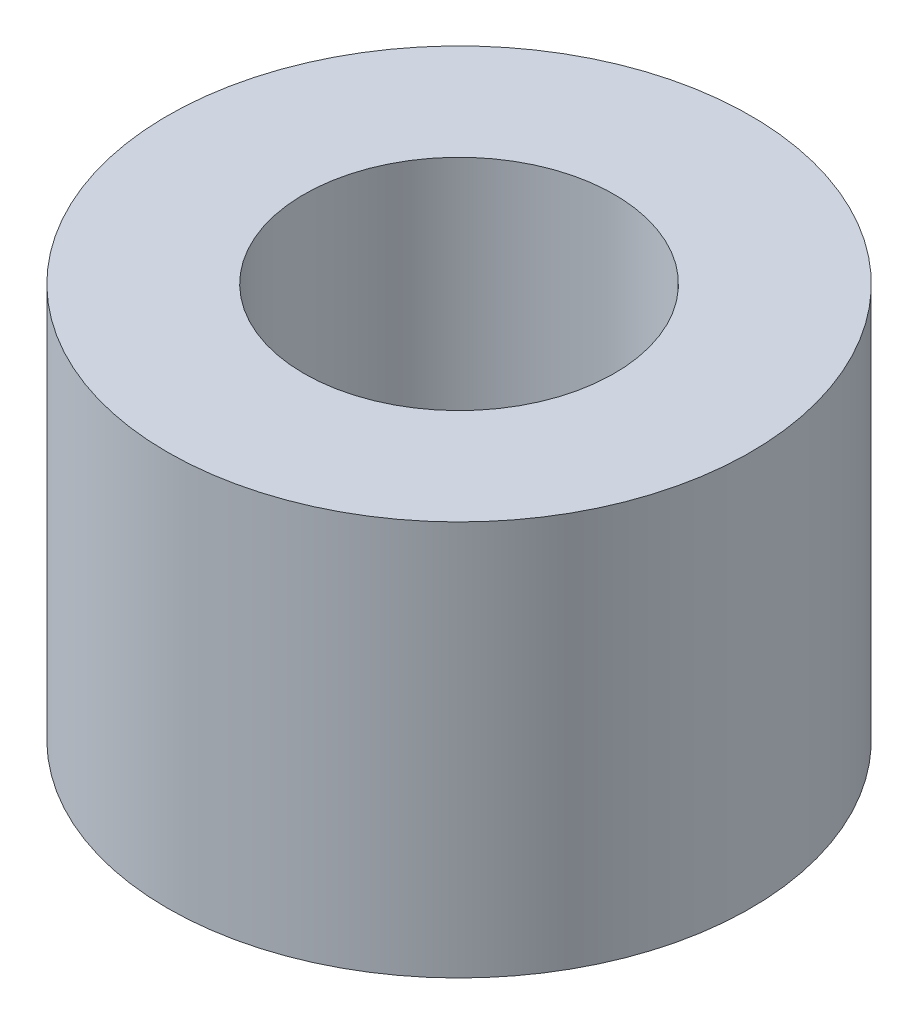
ISO-10303-21;
HEADER;
FILE_DESCRIPTION(('STEP AP214'),'2;1');
FILE_NAME('part.step','',(''),(''),'','','');
FILE_SCHEMA(('AUTOMOTIVE_DESIGN { 1 0 10303 214 1 1 1 1 }'));
ENDSEC;
DATA;
#1=APPLICATION_CONTEXT('core data for automotive mechanical design processes');
#2=APPLICATION_PROTOCOL_DEFINITION('international standard','automotive_design',2000,#1);
#3=PRODUCT_CONTEXT('',#1,'mechanical');
#4=PRODUCT('Part','Part','',(#3));
#5=PRODUCT_RELATED_PRODUCT_CATEGORY('part','',(#4));
#6=PRODUCT_DEFINITION_FORMATION('','',#4);
#7=PRODUCT_DEFINITION_CONTEXT('part definition',#1,'design');
#8=PRODUCT_DEFINITION('design','',#6,#7);
#9=PRODUCT_DEFINITION_SHAPE('','',#8);
#10=(LENGTH_UNIT() NAMED_UNIT(*) SI_UNIT(.MILLI.,.METRE.));
#11=(NAMED_UNIT(*) PLANE_ANGLE_UNIT() SI_UNIT($,.RADIAN.));
#12=(NAMED_UNIT(*) SI_UNIT($,.STERADIAN.) SOLID_ANGLE_UNIT());
#13=UNCERTAINTY_MEASURE_WITH_UNIT(LENGTH_MEASURE(1.E-05),#10,'distance_accuracy_value','');
#14=(GEOMETRIC_REPRESENTATION_CONTEXT(3) GLOBAL_UNCERTAINTY_ASSIGNED_CONTEXT((#13)) GLOBAL_UNIT_ASSIGNED_CONTEXT((#10,
#11,#12)) REPRESENTATION_CONTEXT('',''));
#15=CARTESIAN_POINT('',(0.,0.,0.));
#16=DIRECTION('',(0.,0.,1.));
#17=DIRECTION('',(1.,0.,0.));
#18=AXIS2_PLACEMENT_3D('',#15,#16,#17);
#19=CARTESIAN_POINT('',(0.,4.2,0.));
#20=DIRECTION('',(0.,1.,0.));
#21=DIRECTION('',(0.,0.,1.));
#22=AXIS2_PLACEMENT_3D('',#19,#20,#21);
#23=PLANE('',#22);
#24=CARTESIAN_POINT('',(0.,4.2,0.));
#25=DIRECTION('',(0.,1.,0.));
#26=DIRECTION('',(0.,0.,1.));
#27=AXIS2_PLACEMENT_3D('',#24,#25,#26);
#28=CIRCLE('',#27,3.1);
#29=CARTESIAN_POINT('',(0.,4.2,3.1));
#30=VERTEX_POINT('',#29);
#31=EDGE_CURVE('E10',#30,#30,#28,.T.);
#32=ORIENTED_EDGE('',*,*,#31,.T.);
#33=EDGE_LOOP('',(#32));
#34=FACE_BOUND('',#33,.T.);
#35=CARTESIAN_POINT('',(0.,4.2,0.));
#36=DIRECTION('',(0.,1.,0.));
#37=DIRECTION('',(0.,0.,1.));
#38=AXIS2_PLACEMENT_3D('',#35,#36,#37);
#39=CIRCLE('',#38,1.65);
#40=CARTESIAN_POINT('',(0.,4.2,1.65));
#41=VERTEX_POINT('',#40);
#42=EDGE_CURVE('E42',#41,#41,#39,.T.);
#43=ORIENTED_EDGE('',*,*,#42,.F.);
#44=EDGE_LOOP('',(#43));
#45=FACE_BOUND('',#44,.T.);
#46=ADVANCED_FACE('F31',(#34,#45),#23,.T.);
#47=CARTESIAN_POINT('',(0.,0.,0.));
#48=DIRECTION('',(0.,1.,0.));
#49=DIRECTION('',(0.,0.,1.));
#50=AXIS2_PLACEMENT_3D('',#47,#48,#49);
#51=PLANE('',#50);
#52=CARTESIAN_POINT('',(0.,0.,0.));
#53=DIRECTION('',(0.,1.,0.));
#54=DIRECTION('',(0.,0.,1.));
#55=AXIS2_PLACEMENT_3D('',#52,#53,#54);
#56=CIRCLE('',#55,3.1);
#57=CARTESIAN_POINT('',(0.,0.,3.1));
#58=VERTEX_POINT('',#57);
#59=EDGE_CURVE('E35',#58,#58,#56,.T.);
#60=ORIENTED_EDGE('',*,*,#59,.F.);
#61=EDGE_LOOP('',(#60));
#62=FACE_BOUND('',#61,.T.);
#63=CARTESIAN_POINT('',(0.,0.,0.));
#64=DIRECTION('',(0.,1.,0.));
#65=DIRECTION('',(0.,0.,1.));
#66=AXIS2_PLACEMENT_3D('',#63,#64,#65);
#67=CIRCLE('',#66,1.65);
#68=CARTESIAN_POINT('',(0.,0.,1.65));
#69=VERTEX_POINT('',#68);
#70=EDGE_CURVE('E44',#69,#69,#67,.T.);
#71=ORIENTED_EDGE('',*,*,#70,.T.);
#72=EDGE_LOOP('',(#71));
#73=FACE_BOUND('',#72,.T.);
#74=ADVANCED_FACE('F54',(#62,#73),#51,.F.);
#75=CARTESIAN_POINT('',(0.,4.2,0.));
#76=DIRECTION('',(0.,-1.,0.));
#77=DIRECTION('',(0.,0.,-1.));
#78=AXIS2_PLACEMENT_3D('',#75,#76,#77);
#79=CYLINDRICAL_SURFACE('',#78,3.1);
#80=ORIENTED_EDGE('',*,*,#31,.F.);
#81=EDGE_LOOP('',(#80));
#82=FACE_BOUND('',#81,.T.);
#83=ORIENTED_EDGE('',*,*,#59,.T.);
#84=EDGE_LOOP('',(#83));
#85=FACE_BOUND('',#84,.T.);
#86=ADVANCED_FACE('F33',(#82,#85),#79,.T.);
#87=CARTESIAN_POINT('',(0.,4.2,0.));
#88=DIRECTION('',(0.,-1.,0.));
#89=DIRECTION('',(0.,0.,-1.));
#90=AXIS2_PLACEMENT_3D('',#87,#88,#89);
#91=CYLINDRICAL_SURFACE('',#90,1.65);
#92=ORIENTED_EDGE('',*,*,#42,.T.);
#93=EDGE_LOOP('',(#92));
#94=FACE_BOUND('',#93,.T.);
#95=ORIENTED_EDGE('',*,*,#70,.F.);
#96=EDGE_LOOP('',(#95));
#97=FACE_BOUND('',#96,.T.);
#98=ADVANCED_FACE('F50',(#94,#97),#91,.F.);
#99=CLOSED_SHELL('',(#46,#74,#86,#98));
#100=MANIFOLD_SOLID_BREP('B2',#99);
#101=ADVANCED_BREP_SHAPE_REPRESENTATION('',(#18,#100),#14);
#102=SHAPE_DEFINITION_REPRESENTATION(#9,#101);
ENDSEC;
END-ISO-10303-21;
